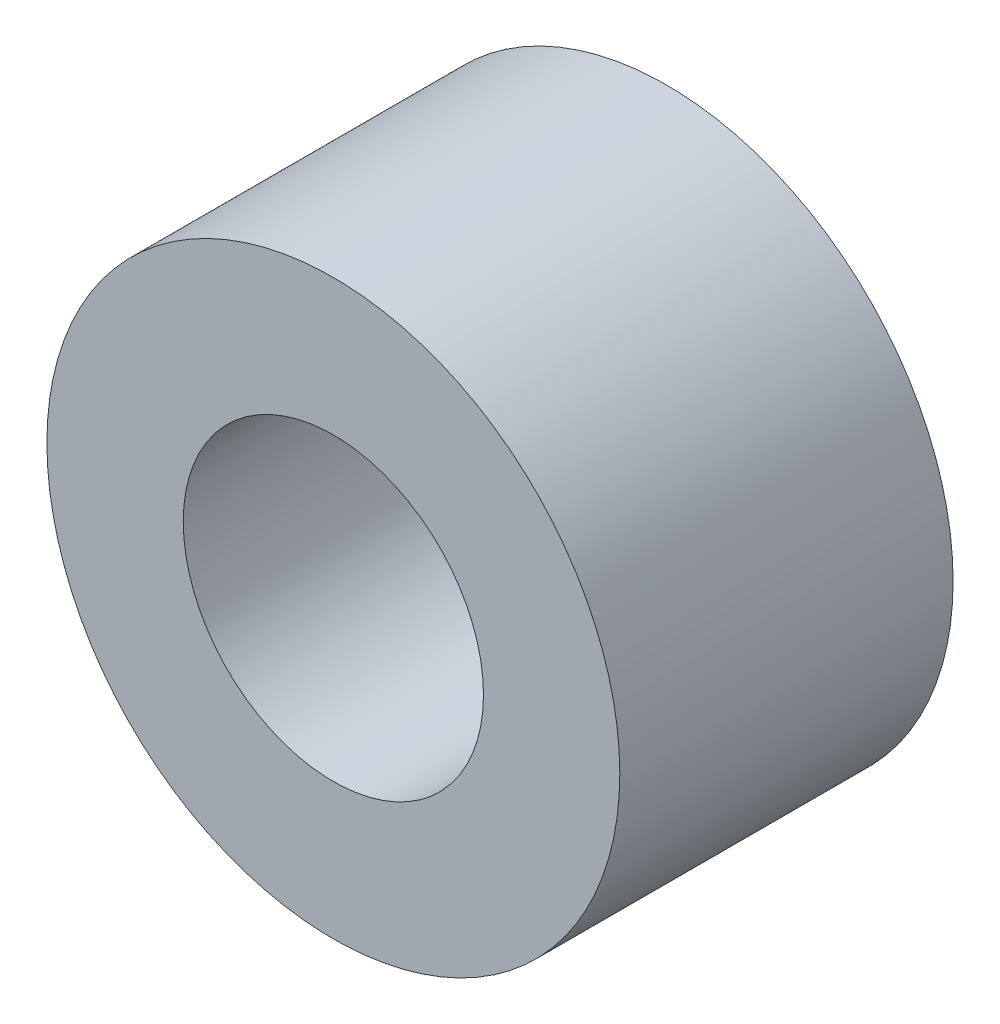
ISO-10303-21;
HEADER;
FILE_DESCRIPTION(('STEP AP214'),'2;1');
FILE_NAME('part.step','',(''),(''),'','','');
FILE_SCHEMA(('AUTOMOTIVE_DESIGN { 1 0 10303 214 1 1 1 1 }'));
ENDSEC;
DATA;
#1=APPLICATION_CONTEXT('core data for automotive mechanical design processes');
#2=APPLICATION_PROTOCOL_DEFINITION('international standard','automotive_design',2000,#1);
#3=PRODUCT_CONTEXT('',#1,'mechanical');
#4=PRODUCT('Part','Part','',(#3));
#5=PRODUCT_RELATED_PRODUCT_CATEGORY('part','',(#4));
#6=PRODUCT_DEFINITION_FORMATION('','',#4);
#7=PRODUCT_DEFINITION_CONTEXT('part definition',#1,'design');
#8=PRODUCT_DEFINITION('design','',#6,#7);
#9=PRODUCT_DEFINITION_SHAPE('','',#8);
#10=(LENGTH_UNIT() NAMED_UNIT(*) SI_UNIT(.MILLI.,.METRE.));
#11=(NAMED_UNIT(*) PLANE_ANGLE_UNIT() SI_UNIT($,.RADIAN.));
#12=(NAMED_UNIT(*) SI_UNIT($,.STERADIAN.) SOLID_ANGLE_UNIT());
#13=UNCERTAINTY_MEASURE_WITH_UNIT(LENGTH_MEASURE(1.E-05),#10,'distance_accuracy_value','');
#14=(GEOMETRIC_REPRESENTATION_CONTEXT(3) GLOBAL_UNCERTAINTY_ASSIGNED_CONTEXT((#13)) GLOBAL_UNIT_ASSIGNED_CONTEXT((#10,
#11,#12)) REPRESENTATION_CONTEXT('',''));
#15=CARTESIAN_POINT('',(0.,0.,0.));
#16=DIRECTION('',(0.,0.,1.));
#17=DIRECTION('',(1.,0.,0.));
#18=AXIS2_PLACEMENT_3D('',#15,#16,#17);
#19=CARTESIAN_POINT('',(0.,0.,9.18));
#20=DIRECTION('',(0.,0.,1.));
#21=DIRECTION('',(1.,0.,0.));
#22=AXIS2_PLACEMENT_3D('',#19,#20,#21);
#23=PLANE('',#22);
#24=CARTESIAN_POINT('',(0.,0.,9.18));
#25=DIRECTION('',(0.,0.,1.));
#26=DIRECTION('',(1.,0.,0.));
#27=AXIS2_PLACEMENT_3D('',#24,#25,#26);
#28=CIRCLE('',#27,7.89);
#29=CARTESIAN_POINT('',(7.89,0.,9.18));
#30=VERTEX_POINT('',#29);
#31=EDGE_CURVE('E10',#30,#30,#28,.T.);
#32=ORIENTED_EDGE('',*,*,#31,.T.);
#33=EDGE_LOOP('',(#32));
#34=FACE_BOUND('',#33,.T.);
#35=CARTESIAN_POINT('',(0.,0.,9.18));
#36=DIRECTION('',(0.,0.,1.));
#37=DIRECTION('',(1.,0.,0.));
#38=AXIS2_PLACEMENT_3D('',#35,#36,#37);
#39=CIRCLE('',#38,4.135);
#40=CARTESIAN_POINT('',(4.135,0.,9.18));
#41=VERTEX_POINT('',#40);
#42=EDGE_CURVE('E48',#41,#41,#39,.T.);
#43=ORIENTED_EDGE('',*,*,#42,.F.);
#44=EDGE_LOOP('',(#43));
#45=FACE_BOUND('',#44,.T.);
#46=ADVANCED_FACE('F37',(#34,#45),#23,.T.);
#47=CARTESIAN_POINT('',(0.,0.,0.));
#48=DIRECTION('',(0.,0.,1.));
#49=DIRECTION('',(1.,0.,0.));
#50=AXIS2_PLACEMENT_3D('',#47,#48,#49);
#51=PLANE('',#50);
#52=CARTESIAN_POINT('',(0.,0.,0.));
#53=DIRECTION('',(0.,0.,1.));
#54=DIRECTION('',(1.,0.,0.));
#55=AXIS2_PLACEMENT_3D('',#52,#53,#54);
#56=CIRCLE('',#55,7.89);
#57=CARTESIAN_POINT('',(7.89,0.,0.));
#58=VERTEX_POINT('',#57);
#59=EDGE_CURVE('E41',#58,#58,#56,.T.);
#60=ORIENTED_EDGE('',*,*,#59,.F.);
#61=EDGE_LOOP('',(#60));
#62=FACE_BOUND('',#61,.T.);
#63=CARTESIAN_POINT('',(0.,0.,0.));
#64=DIRECTION('',(0.,0.,1.));
#65=DIRECTION('',(1.,0.,0.));
#66=AXIS2_PLACEMENT_3D('',#63,#64,#65);
#67=CIRCLE('',#66,4.135);
#68=CARTESIAN_POINT('',(4.135,0.,0.));
#69=VERTEX_POINT('',#68);
#70=EDGE_CURVE('E50',#69,#69,#67,.T.);
#71=ORIENTED_EDGE('',*,*,#70,.T.);
#72=EDGE_LOOP('',(#71));
#73=FACE_BOUND('',#72,.T.);
#74=ADVANCED_FACE('F60',(#62,#73),#51,.F.);
#75=CARTESIAN_POINT('',(0.,0.,9.18));
#76=DIRECTION('',(0.,0.,-1.));
#77=DIRECTION('',(-1.,0.,0.));
#78=AXIS2_PLACEMENT_3D('',#75,#76,#77);
#79=CYLINDRICAL_SURFACE('',#78,7.89);
#80=ORIENTED_EDGE('',*,*,#31,.F.);
#81=EDGE_LOOP('',(#80));
#82=FACE_BOUND('',#81,.T.);
#83=ORIENTED_EDGE('',*,*,#59,.T.);
#84=EDGE_LOOP('',(#83));
#85=FACE_BOUND('',#84,.T.);
#86=ADVANCED_FACE('F39',(#82,#85),#79,.T.);
#87=CARTESIAN_POINT('',(0.,0.,9.18));
#88=DIRECTION('',(0.,0.,-1.));
#89=DIRECTION('',(-1.,0.,0.));
#90=AXIS2_PLACEMENT_3D('',#87,#88,#89);
#91=CYLINDRICAL_SURFACE('',#90,4.135);
#92=ORIENTED_EDGE('',*,*,#42,.T.);
#93=EDGE_LOOP('',(#92));
#94=FACE_BOUND('',#93,.T.);
#95=ORIENTED_EDGE('',*,*,#70,.F.);
#96=EDGE_LOOP('',(#95));
#97=FACE_BOUND('',#96,.T.);
#98=ADVANCED_FACE('F56',(#94,#97),#91,.F.);
#99=CLOSED_SHELL('',(#46,#74,#86,#98));
#100=MANIFOLD_SOLID_BREP('B2',#99);
#101=ADVANCED_BREP_SHAPE_REPRESENTATION('',(#18,#100),#14);
#102=SHAPE_DEFINITION_REPRESENTATION(#9,#101);
ENDSEC;
END-ISO-10303-21;
